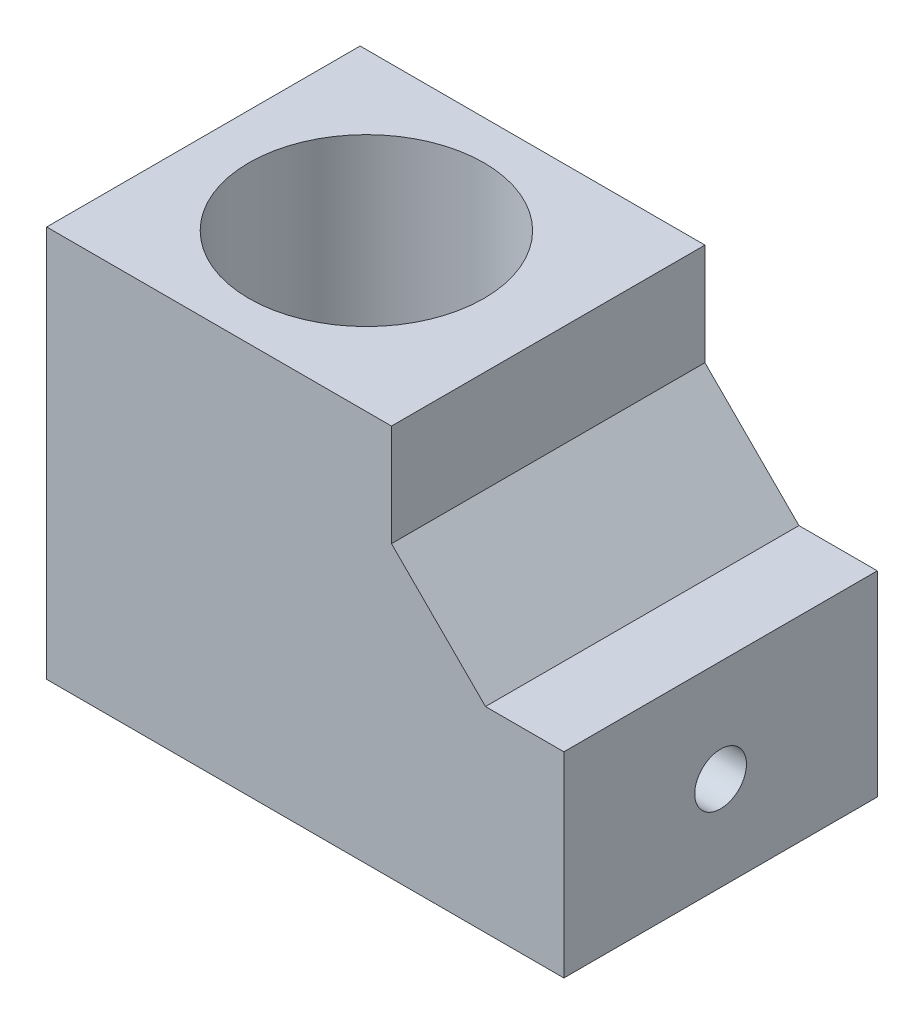
ISO-10303-21;
HEADER;
FILE_DESCRIPTION(('STEP AP214'),'2;1');
FILE_NAME('part.step','',(''),(''),'','','');
FILE_SCHEMA(('AUTOMOTIVE_DESIGN { 1 0 10303 214 1 1 1 1 }'));
ENDSEC;
DATA;
#1=APPLICATION_CONTEXT('core data for automotive mechanical design processes');
#2=APPLICATION_PROTOCOL_DEFINITION('international standard','automotive_design',2000,#1);
#3=PRODUCT_CONTEXT('',#1,'mechanical');
#4=PRODUCT('Part','Part','',(#3));
#5=PRODUCT_RELATED_PRODUCT_CATEGORY('part','',(#4));
#6=PRODUCT_DEFINITION_FORMATION('','',#4);
#7=PRODUCT_DEFINITION_CONTEXT('part definition',#1,'design');
#8=PRODUCT_DEFINITION('design','',#6,#7);
#9=PRODUCT_DEFINITION_SHAPE('','',#8);
#10=(LENGTH_UNIT() NAMED_UNIT(*) SI_UNIT(.MILLI.,.METRE.));
#11=(NAMED_UNIT(*) PLANE_ANGLE_UNIT() SI_UNIT($,.RADIAN.));
#12=(NAMED_UNIT(*) SI_UNIT($,.STERADIAN.) SOLID_ANGLE_UNIT());
#13=UNCERTAINTY_MEASURE_WITH_UNIT(LENGTH_MEASURE(1.E-05),#10,'distance_accuracy_value','');
#14=(GEOMETRIC_REPRESENTATION_CONTEXT(3) GLOBAL_UNCERTAINTY_ASSIGNED_CONTEXT((#13)) GLOBAL_UNIT_ASSIGNED_CONTEXT((#10,
#11,#12)) REPRESENTATION_CONTEXT('',''));
#15=CARTESIAN_POINT('',(0.,0.,0.));
#16=DIRECTION('',(0.,0.,1.));
#17=DIRECTION('',(1.,0.,0.));
#18=AXIS2_PLACEMENT_3D('',#15,#16,#17);
#19=CARTESIAN_POINT('',(0.,25.,-20.));
#20=DIRECTION('',(-1.,0.,0.));
#21=DIRECTION('',(0.,-1.,0.));
#22=AXIS2_PLACEMENT_3D('',#19,#20,#21);
#23=PLANE('',#22);
#24=DIRECTION('',(0.,-1.,0.));
#25=VECTOR('',#24,1.);
#26=CARTESIAN_POINT('',(0.,25.,0.));
#27=LINE('',#26,#25);
#28=CARTESIAN_POINT('',(0.,25.,0.));
#29=VERTEX_POINT('',#28);
#30=CARTESIAN_POINT('',(0.,0.,0.));
#31=VERTEX_POINT('',#30);
#32=EDGE_CURVE('E130',#29,#31,#27,.T.);
#33=ORIENTED_EDGE('',*,*,#32,.F.);
#34=DIRECTION('',(0.,0.,1.));
#35=VECTOR('',#34,1.);
#36=CARTESIAN_POINT('',(0.,25.,-20.));
#37=LINE('',#36,#35);
#38=CARTESIAN_POINT('',(0.,25.,-20.));
#39=VERTEX_POINT('',#38);
#40=EDGE_CURVE('E11',#39,#29,#37,.T.);
#41=ORIENTED_EDGE('',*,*,#40,.F.);
#42=DIRECTION('',(0.,-1.,0.));
#43=VECTOR('',#42,1.);
#44=CARTESIAN_POINT('',(0.,25.,-20.));
#45=LINE('',#44,#43);
#46=CARTESIAN_POINT('',(0.,0.,-20.));
#47=VERTEX_POINT('',#46);
#48=EDGE_CURVE('E148',#39,#47,#45,.T.);
#49=ORIENTED_EDGE('',*,*,#48,.T.);
#50=DIRECTION('',(0.,0.,1.));
#51=VECTOR('',#50,1.);
#52=CARTESIAN_POINT('',(0.,0.,-20.));
#53=LINE('',#52,#51);
#54=EDGE_CURVE('E40',#47,#31,#53,.T.);
#55=ORIENTED_EDGE('',*,*,#54,.T.);
#56=EDGE_LOOP('',(#33,#41,#49,#55));
#57=FACE_BOUND('',#56,.T.);
#58=ADVANCED_FACE('F37',(#57),#23,.T.);
#59=CARTESIAN_POINT('',(22.,25.,-20.));
#60=DIRECTION('',(0.,1.,0.));
#61=DIRECTION('',(-1.,0.,0.));
#62=AXIS2_PLACEMENT_3D('',#59,#60,#61);
#63=PLANE('',#62);
#64=CARTESIAN_POINT('',(10.4,25.,-10.));
#65=DIRECTION('',(0.,-1.,0.));
#66=DIRECTION('',(0.,0.,-1.));
#67=AXIS2_PLACEMENT_3D('',#64,#65,#66);
#68=CIRCLE('',#67,7.5);
#69=CARTESIAN_POINT('',(10.4,25.,-17.5));
#70=VERTEX_POINT('',#69);
#71=EDGE_CURVE('E134',#70,#70,#68,.T.);
#72=ORIENTED_EDGE('',*,*,#71,.T.);
#73=EDGE_LOOP('',(#72));
#74=FACE_BOUND('',#73,.T.);
#75=DIRECTION('',(-1.,0.,0.));
#76=VECTOR('',#75,1.);
#77=CARTESIAN_POINT('',(22.,25.,0.));
#78=LINE('',#77,#76);
#79=CARTESIAN_POINT('',(22.,25.,0.));
#80=VERTEX_POINT('',#79);
#81=EDGE_CURVE('E146',#80,#29,#78,.T.);
#82=ORIENTED_EDGE('',*,*,#81,.F.);
#83=DIRECTION('',(0.,0.,1.));
#84=VECTOR('',#83,1.);
#85=CARTESIAN_POINT('',(22.,25.,-20.));
#86=LINE('',#85,#84);
#87=CARTESIAN_POINT('',(22.,25.,-20.));
#88=VERTEX_POINT('',#87);
#89=EDGE_CURVE('E46',#88,#80,#86,.T.);
#90=ORIENTED_EDGE('',*,*,#89,.F.);
#91=DIRECTION('',(-1.,0.,0.));
#92=VECTOR('',#91,1.);
#93=CARTESIAN_POINT('',(22.,25.,-20.));
#94=LINE('',#93,#92);
#95=EDGE_CURVE('E120',#88,#39,#94,.T.);
#96=ORIENTED_EDGE('',*,*,#95,.T.);
#97=ORIENTED_EDGE('',*,*,#40,.T.);
#98=EDGE_LOOP('',(#82,#90,#96,#97));
#99=FACE_BOUND('',#98,.T.);
#100=ADVANCED_FACE('F158',(#74,#99),#63,.T.);
#101=CARTESIAN_POINT('',(22.,18.5,-20.));
#102=DIRECTION('',(1.,0.,0.));
#103=DIRECTION('',(0.,0.,-1.));
#104=AXIS2_PLACEMENT_3D('',#101,#102,#103);
#105=PLANE('',#104);
#106=DIRECTION('',(0.,1.,0.));
#107=VECTOR('',#106,1.);
#108=CARTESIAN_POINT('',(22.,18.5,0.));
#109=LINE('',#108,#107);
#110=CARTESIAN_POINT('',(22.,18.5,0.));
#111=VERTEX_POINT('',#110);
#112=EDGE_CURVE('E107',#111,#80,#109,.T.);
#113=ORIENTED_EDGE('',*,*,#112,.F.);
#114=DIRECTION('',(0.,0.,1.));
#115=VECTOR('',#114,1.);
#116=CARTESIAN_POINT('',(22.,18.5,-20.));
#117=LINE('',#116,#115);
#118=CARTESIAN_POINT('',(22.,18.5,-20.));
#119=VERTEX_POINT('',#118);
#120=EDGE_CURVE('E102',#119,#111,#117,.T.);
#121=ORIENTED_EDGE('',*,*,#120,.F.);
#122=DIRECTION('',(0.,1.,0.));
#123=VECTOR('',#122,1.);
#124=CARTESIAN_POINT('',(22.,18.5,-20.));
#125=LINE('',#124,#123);
#126=EDGE_CURVE('E105',#119,#88,#125,.T.);
#127=ORIENTED_EDGE('',*,*,#126,.T.);
#128=ORIENTED_EDGE('',*,*,#89,.T.);
#129=EDGE_LOOP('',(#113,#121,#127,#128));
#130=FACE_BOUND('',#129,.T.);
#131=ADVANCED_FACE('F104',(#130),#105,.T.);
#132=CARTESIAN_POINT('',(28.,12.5,-20.));
#133=DIRECTION('',(0.707106781186546,0.707106781186549,0.));
#134=DIRECTION('',(-0.707106781186549,0.707106781186546,0.));
#135=AXIS2_PLACEMENT_3D('',#132,#133,#134);
#136=PLANE('',#135);
#137=DIRECTION('',(-0.707106781186549,0.707106781186546,0.));
#138=VECTOR('',#137,1.);
#139=CARTESIAN_POINT('',(28.,12.5,0.));
#140=LINE('',#139,#138);
#141=CARTESIAN_POINT('',(28.,12.5,0.));
#142=VERTEX_POINT('',#141);
#143=EDGE_CURVE('E143',#142,#111,#140,.T.);
#144=ORIENTED_EDGE('',*,*,#143,.F.);
#145=DIRECTION('',(0.,0.,1.));
#146=VECTOR('',#145,1.);
#147=CARTESIAN_POINT('',(28.,12.5,-20.));
#148=LINE('',#147,#146);
#149=CARTESIAN_POINT('',(28.,12.5,-20.));
#150=VERTEX_POINT('',#149);
#151=EDGE_CURVE('E112',#150,#142,#148,.T.);
#152=ORIENTED_EDGE('',*,*,#151,.F.);
#153=DIRECTION('',(-0.707106781186549,0.707106781186546,0.));
#154=VECTOR('',#153,1.);
#155=CARTESIAN_POINT('',(28.,12.5,-20.));
#156=LINE('',#155,#154);
#157=EDGE_CURVE('E118',#150,#119,#156,.T.);
#158=ORIENTED_EDGE('',*,*,#157,.T.);
#159=ORIENTED_EDGE('',*,*,#120,.T.);
#160=EDGE_LOOP('',(#144,#152,#158,#159));
#161=FACE_BOUND('',#160,.T.);
#162=ADVANCED_FACE('F122',(#161),#136,.T.);
#163=CARTESIAN_POINT('',(33.,12.5,-20.));
#164=DIRECTION('',(0.,1.,0.));
#165=DIRECTION('',(-1.,0.,0.));
#166=AXIS2_PLACEMENT_3D('',#163,#164,#165);
#167=PLANE('',#166);
#168=DIRECTION('',(-1.,0.,0.));
#169=VECTOR('',#168,1.);
#170=CARTESIAN_POINT('',(33.,12.5,0.));
#171=LINE('',#170,#169);
#172=CARTESIAN_POINT('',(33.,12.5,0.));
#173=VERTEX_POINT('',#172);
#174=EDGE_CURVE('E140',#173,#142,#171,.T.);
#175=ORIENTED_EDGE('',*,*,#174,.F.);
#176=DIRECTION('',(0.,0.,1.));
#177=VECTOR('',#176,1.);
#178=CARTESIAN_POINT('',(33.,12.5,-20.));
#179=LINE('',#178,#177);
#180=CARTESIAN_POINT('',(33.,12.5,-20.));
#181=VERTEX_POINT('',#180);
#182=EDGE_CURVE('E152',#181,#173,#179,.T.);
#183=ORIENTED_EDGE('',*,*,#182,.F.);
#184=DIRECTION('',(-1.,0.,0.));
#185=VECTOR('',#184,1.);
#186=CARTESIAN_POINT('',(33.,12.5,-20.));
#187=LINE('',#186,#185);
#188=EDGE_CURVE('E123',#181,#150,#187,.T.);
#189=ORIENTED_EDGE('',*,*,#188,.T.);
#190=ORIENTED_EDGE('',*,*,#151,.T.);
#191=EDGE_LOOP('',(#175,#183,#189,#190));
#192=FACE_BOUND('',#191,.T.);
#193=ADVANCED_FACE('F173',(#192),#167,.T.);
#194=CARTESIAN_POINT('',(33.,0.,-20.));
#195=DIRECTION('',(1.,0.,0.));
#196=DIRECTION('',(0.,0.,-1.));
#197=AXIS2_PLACEMENT_3D('',#194,#195,#196);
#198=PLANE('',#197);
#199=CARTESIAN_POINT('',(33.,6.,-10.));
#200=DIRECTION('',(1.,0.,0.));
#201=DIRECTION('',(0.,0.,-1.));
#202=AXIS2_PLACEMENT_3D('',#199,#200,#201);
#203=CIRCLE('',#202,1.65);
#204=CARTESIAN_POINT('',(33.,6.,-11.65));
#205=VERTEX_POINT('',#204);
#206=EDGE_CURVE('E193',#205,#205,#203,.T.);
#207=ORIENTED_EDGE('',*,*,#206,.F.);
#208=EDGE_LOOP('',(#207));
#209=FACE_BOUND('',#208,.T.);
#210=DIRECTION('',(0.,1.,0.));
#211=VECTOR('',#210,1.);
#212=CARTESIAN_POINT('',(33.,0.,0.));
#213=LINE('',#212,#211);
#214=CARTESIAN_POINT('',(33.,0.,0.));
#215=VERTEX_POINT('',#214);
#216=EDGE_CURVE('E137',#215,#173,#213,.T.);
#217=ORIENTED_EDGE('',*,*,#216,.F.);
#218=DIRECTION('',(0.,0.,1.));
#219=VECTOR('',#218,1.);
#220=CARTESIAN_POINT('',(33.,0.,-20.));
#221=LINE('',#220,#219);
#222=CARTESIAN_POINT('',(33.,0.,-20.));
#223=VERTEX_POINT('',#222);
#224=EDGE_CURVE('E153',#223,#215,#221,.T.);
#225=ORIENTED_EDGE('',*,*,#224,.F.);
#226=DIRECTION('',(0.,1.,0.));
#227=VECTOR('',#226,1.);
#228=CARTESIAN_POINT('',(33.,0.,-20.));
#229=LINE('',#228,#227);
#230=EDGE_CURVE('E125',#223,#181,#229,.T.);
#231=ORIENTED_EDGE('',*,*,#230,.T.);
#232=ORIENTED_EDGE('',*,*,#182,.T.);
#233=EDGE_LOOP('',(#217,#225,#231,#232));
#234=FACE_BOUND('',#233,.T.);
#235=ADVANCED_FACE('F176',(#209,#234),#198,.T.);
#236=CARTESIAN_POINT('',(0.,0.,-20.));
#237=DIRECTION('',(0.,-1.,0.));
#238=DIRECTION('',(0.,0.,-1.));
#239=AXIS2_PLACEMENT_3D('',#236,#237,#238);
#240=PLANE('',#239);
#241=CARTESIAN_POINT('',(10.4,0.,-10.));
#242=DIRECTION('',(0.,-1.,0.));
#243=DIRECTION('',(0.,0.,-1.));
#244=AXIS2_PLACEMENT_3D('',#241,#242,#243);
#245=CIRCLE('',#244,7.5);
#246=CARTESIAN_POINT('',(10.4,0.,-17.5));
#247=VERTEX_POINT('',#246);
#248=EDGE_CURVE('E187',#247,#247,#245,.T.);
#249=ORIENTED_EDGE('',*,*,#248,.F.);
#250=EDGE_LOOP('',(#249));
#251=FACE_BOUND('',#250,.T.);
#252=DIRECTION('',(1.,0.,0.));
#253=VECTOR('',#252,1.);
#254=CARTESIAN_POINT('',(0.,0.,0.));
#255=LINE('',#254,#253);
#256=EDGE_CURVE('E133',#31,#215,#255,.T.);
#257=ORIENTED_EDGE('',*,*,#256,.F.);
#258=ORIENTED_EDGE('',*,*,#54,.F.);
#259=DIRECTION('',(1.,0.,0.));
#260=VECTOR('',#259,1.);
#261=CARTESIAN_POINT('',(0.,0.,-20.));
#262=LINE('',#261,#260);
#263=EDGE_CURVE('E197',#47,#223,#262,.T.);
#264=ORIENTED_EDGE('',*,*,#263,.T.);
#265=ORIENTED_EDGE('',*,*,#224,.T.);
#266=EDGE_LOOP('',(#257,#258,#264,#265));
#267=FACE_BOUND('',#266,.T.);
#268=ADVANCED_FACE('F155',(#251,#267),#240,.T.);
#269=CARTESIAN_POINT('',(0.,0.,-20.));
#270=DIRECTION('',(0.,0.,1.));
#271=DIRECTION('',(1.,0.,0.));
#272=AXIS2_PLACEMENT_3D('',#269,#270,#271);
#273=PLANE('',#272);
#274=ORIENTED_EDGE('',*,*,#48,.F.);
#275=ORIENTED_EDGE('',*,*,#95,.F.);
#276=ORIENTED_EDGE('',*,*,#126,.F.);
#277=ORIENTED_EDGE('',*,*,#157,.F.);
#278=ORIENTED_EDGE('',*,*,#188,.F.);
#279=ORIENTED_EDGE('',*,*,#230,.F.);
#280=ORIENTED_EDGE('',*,*,#263,.F.);
#281=EDGE_LOOP('',(#274,#275,#276,#277,#278,#279,#280));
#282=FACE_BOUND('',#281,.T.);
#283=ADVANCED_FACE('F116',(#282),#273,.F.);
#284=CARTESIAN_POINT('',(0.,0.,0.));
#285=DIRECTION('',(0.,0.,1.));
#286=DIRECTION('',(1.,0.,0.));
#287=AXIS2_PLACEMENT_3D('',#284,#285,#286);
#288=PLANE('',#287);
#289=ORIENTED_EDGE('',*,*,#32,.T.);
#290=ORIENTED_EDGE('',*,*,#256,.T.);
#291=ORIENTED_EDGE('',*,*,#216,.T.);
#292=ORIENTED_EDGE('',*,*,#174,.T.);
#293=ORIENTED_EDGE('',*,*,#143,.T.);
#294=ORIENTED_EDGE('',*,*,#112,.T.);
#295=ORIENTED_EDGE('',*,*,#81,.T.);
#296=EDGE_LOOP('',(#289,#290,#291,#292,#293,#294,#295));
#297=FACE_BOUND('',#296,.T.);
#298=ADVANCED_FACE('F157',(#297),#288,.T.);
#299=CARTESIAN_POINT('',(10.4,25.,-10.));
#300=DIRECTION('',(0.,-1.,0.));
#301=DIRECTION('',(0.,0.,-1.));
#302=AXIS2_PLACEMENT_3D('',#299,#300,#301);
#303=CYLINDRICAL_SURFACE('',#302,7.5);
#304=ORIENTED_EDGE('',*,*,#71,.F.);
#305=EDGE_LOOP('',(#304));
#306=FACE_BOUND('',#305,.T.);
#307=ORIENTED_EDGE('',*,*,#248,.T.);
#308=EDGE_LOOP('',(#307));
#309=FACE_BOUND('',#308,.T.);
#310=ADVANCED_FACE('F214',(#306,#309),#303,.F.);
#311=CARTESIAN_POINT('',(22.9,6.,-10.));
#312=DIRECTION('',(1.,0.,0.));
#313=DIRECTION('',(0.,0.,-1.));
#314=AXIS2_PLACEMENT_3D('',#311,#312,#313);
#315=CONICAL_SURFACE('',#314,1.65,1.02974425867665);
#316=CARTESIAN_POINT('',(21.9085799786045,6.,-10.));
#317=VERTEX_POINT('',#316);
#318=VERTEX_LOOP('',#317);
#319=FACE_BOUND('',#318,.T.);
#320=CARTESIAN_POINT('',(22.9,6.,-10.));
#321=DIRECTION('',(1.,0.,0.));
#322=DIRECTION('',(0.,0.,-1.));
#323=AXIS2_PLACEMENT_3D('',#320,#321,#322);
#324=CIRCLE('',#323,1.65);
#325=CARTESIAN_POINT('',(22.9,6.,-11.65));
#326=VERTEX_POINT('',#325);
#327=EDGE_CURVE('E189',#326,#326,#324,.T.);
#328=ORIENTED_EDGE('',*,*,#327,.T.);
#329=EDGE_LOOP('',(#328));
#330=FACE_BOUND('',#329,.T.);
#331=ADVANCED_FACE('F208',(#319,#330),#315,.F.);
#332=CARTESIAN_POINT('',(33.,6.,-10.));
#333=DIRECTION('',(1.,0.,0.));
#334=DIRECTION('',(0.,0.,-1.));
#335=AXIS2_PLACEMENT_3D('',#332,#333,#334);
#336=CYLINDRICAL_SURFACE('',#335,1.65);
#337=ORIENTED_EDGE('',*,*,#327,.F.);
#338=EDGE_LOOP('',(#337));
#339=FACE_BOUND('',#338,.T.);
#340=ORIENTED_EDGE('',*,*,#206,.T.);
#341=EDGE_LOOP('',(#340));
#342=FACE_BOUND('',#341,.T.);
#343=ADVANCED_FACE('F206',(#339,#342),#336,.F.);
#344=CLOSED_SHELL('',(#58,#100,#131,#162,#193,#235,#268,#283,#298,#310,#331,#343));
#345=MANIFOLD_SOLID_BREP('B2',#344);
#346=ADVANCED_BREP_SHAPE_REPRESENTATION('',(#18,#345),#14);
#347=SHAPE_DEFINITION_REPRESENTATION(#9,#346);
ENDSEC;
END-ISO-10303-21;
